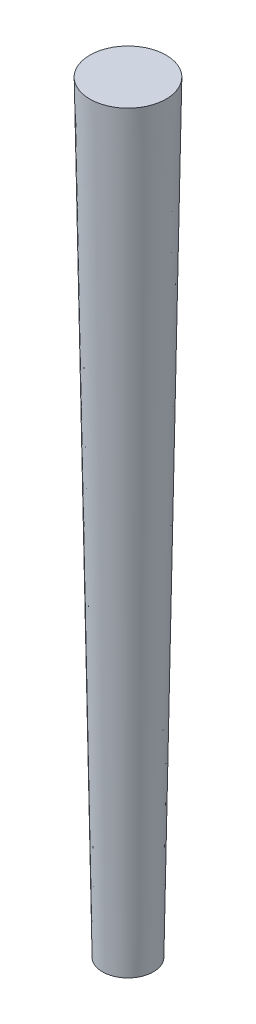
ISO-10303-21;
HEADER;
FILE_DESCRIPTION(('STEP AP214'),'2;1');
FILE_NAME('part.step','',(''),(''),'','','');
FILE_SCHEMA(('AUTOMOTIVE_DESIGN { 1 0 10303 214 1 1 1 1 }'));
ENDSEC;
DATA;
#1=APPLICATION_CONTEXT('core data for automotive mechanical design processes');
#2=APPLICATION_PROTOCOL_DEFINITION('international standard','automotive_design',2000,#1);
#3=PRODUCT_CONTEXT('',#1,'mechanical');
#4=PRODUCT('Part','Part','',(#3));
#5=PRODUCT_RELATED_PRODUCT_CATEGORY('part','',(#4));
#6=PRODUCT_DEFINITION_FORMATION('','',#4);
#7=PRODUCT_DEFINITION_CONTEXT('part definition',#1,'design');
#8=PRODUCT_DEFINITION('design','',#6,#7);
#9=PRODUCT_DEFINITION_SHAPE('','',#8);
#10=(LENGTH_UNIT() NAMED_UNIT(*) SI_UNIT(.MILLI.,.METRE.));
#11=(NAMED_UNIT(*) PLANE_ANGLE_UNIT() SI_UNIT($,.RADIAN.));
#12=(NAMED_UNIT(*) SI_UNIT($,.STERADIAN.) SOLID_ANGLE_UNIT());
#13=UNCERTAINTY_MEASURE_WITH_UNIT(LENGTH_MEASURE(1.E-05),#10,'distance_accuracy_value','');
#14=(GEOMETRIC_REPRESENTATION_CONTEXT(3) GLOBAL_UNCERTAINTY_ASSIGNED_CONTEXT((#13)) GLOBAL_UNIT_ASSIGNED_CONTEXT((#10,
#11,#12)) REPRESENTATION_CONTEXT('',''));
#15=CARTESIAN_POINT('',(0.,0.,0.));
#16=DIRECTION('',(0.,0.,1.));
#17=DIRECTION('',(1.,0.,0.));
#18=AXIS2_PLACEMENT_3D('',#15,#16,#17);
#19=CARTESIAN_POINT('',(0.,0.,0.));
#20=DIRECTION('',(0.,1.,0.));
#21=DIRECTION('',(-1.,0.,0.));
#22=AXIS2_PLACEMENT_3D('',#19,#20,#21);
#23=PLANE('',#22);
#24=CARTESIAN_POINT('',(0.,0.,0.));
#25=DIRECTION('',(0.,1.,0.));
#26=DIRECTION('',(-1.,0.,0.));
#27=AXIS2_PLACEMENT_3D('',#24,#25,#26);
#28=CIRCLE('',#27,2.);
#29=CARTESIAN_POINT('',(-2.,0.,0.));
#30=VERTEX_POINT('',#29);
#31=EDGE_CURVE('E10',#30,#30,#28,.T.);
#32=ORIENTED_EDGE('',*,*,#31,.F.);
#33=EDGE_LOOP('',(#32));
#34=FACE_BOUND('',#33,.T.);
#35=ADVANCED_FACE('F40',(#34),#23,.F.);
#36=CARTESIAN_POINT('',(0.,0.,0.));
#37=DIRECTION('',(0.,1.,0.));
#38=DIRECTION('',(-1.,0.,0.));
#39=AXIS2_PLACEMENT_3D('',#36,#37,#38);
#40=CONICAL_SURFACE('',#39,2.,0.0166651237139408);
#41=CARTESIAN_POINT('',(0.,60.,0.));
#42=DIRECTION('',(0.,1.,0.));
#43=DIRECTION('',(-1.,0.,0.));
#44=AXIS2_PLACEMENT_3D('',#41,#42,#43);
#45=CIRCLE('',#44,3.);
#46=CARTESIAN_POINT('',(-3.00000000000001,60.,0.));
#47=VERTEX_POINT('',#46);
#48=EDGE_CURVE('E43',#47,#47,#45,.T.);
#49=ORIENTED_EDGE('',*,*,#48,.F.);
#50=EDGE_LOOP('',(#49));
#51=FACE_BOUND('',#50,.T.);
#52=ORIENTED_EDGE('',*,*,#31,.T.);
#53=EDGE_LOOP('',(#52));
#54=FACE_BOUND('',#53,.T.);
#55=ADVANCED_FACE('F51',(#51,#54),#40,.T.);
#56=CARTESIAN_POINT('',(2.99999999999999,60.,0.));
#57=DIRECTION('',(0.,-1.,0.));
#58=DIRECTION('',(1.,0.,0.));
#59=AXIS2_PLACEMENT_3D('',#56,#57,#58);
#60=PLANE('',#59);
#61=ORIENTED_EDGE('',*,*,#48,.T.);
#62=EDGE_LOOP('',(#61));
#63=FACE_BOUND('',#62,.T.);
#64=ADVANCED_FACE('F47',(#63),#60,.F.);
#65=CLOSED_SHELL('',(#35,#55,#64));
#66=MANIFOLD_SOLID_BREP('B2',#65);
#67=ADVANCED_BREP_SHAPE_REPRESENTATION('',(#18,#66),#14);
#68=SHAPE_DEFINITION_REPRESENTATION(#9,#67);
ENDSEC;
END-ISO-10303-21;
